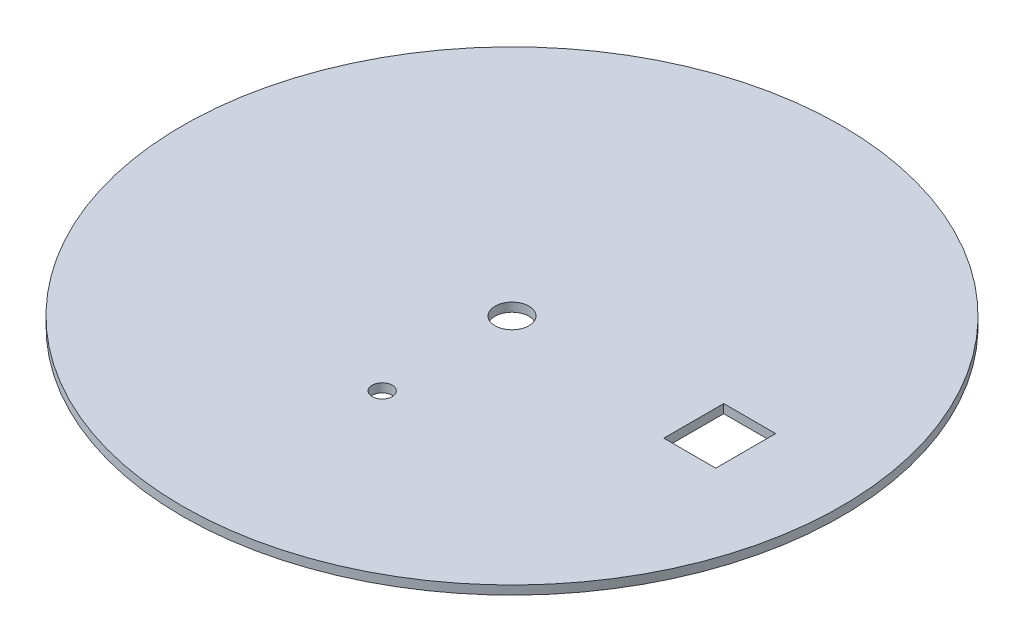
ISO-10303-21;
HEADER;
FILE_DESCRIPTION(('STEP AP214'),'2;1');
FILE_NAME('part.step','',(''),(''),'','','');
FILE_SCHEMA(('AUTOMOTIVE_DESIGN { 1 0 10303 214 1 1 1 1 }'));
ENDSEC;
DATA;
#1=APPLICATION_CONTEXT('core data for automotive mechanical design processes');
#2=APPLICATION_PROTOCOL_DEFINITION('international standard','automotive_design',2000,#1);
#3=PRODUCT_CONTEXT('',#1,'mechanical');
#4=PRODUCT('Part','Part','',(#3));
#5=PRODUCT_RELATED_PRODUCT_CATEGORY('part','',(#4));
#6=PRODUCT_DEFINITION_FORMATION('','',#4);
#7=PRODUCT_DEFINITION_CONTEXT('part definition',#1,'design');
#8=PRODUCT_DEFINITION('design','',#6,#7);
#9=PRODUCT_DEFINITION_SHAPE('','',#8);
#10=(LENGTH_UNIT() NAMED_UNIT(*) SI_UNIT(.MILLI.,.METRE.));
#11=(NAMED_UNIT(*) PLANE_ANGLE_UNIT() SI_UNIT($,.RADIAN.));
#12=(NAMED_UNIT(*) SI_UNIT($,.STERADIAN.) SOLID_ANGLE_UNIT());
#13=UNCERTAINTY_MEASURE_WITH_UNIT(LENGTH_MEASURE(1.E-05),#10,'distance_accuracy_value','');
#14=(GEOMETRIC_REPRESENTATION_CONTEXT(3) GLOBAL_UNCERTAINTY_ASSIGNED_CONTEXT((#13)) GLOBAL_UNIT_ASSIGNED_CONTEXT((#10,
#11,#12)) REPRESENTATION_CONTEXT('',''));
#15=CARTESIAN_POINT('',(0.,0.,0.));
#16=DIRECTION('',(0.,0.,1.));
#17=DIRECTION('',(1.,0.,0.));
#18=AXIS2_PLACEMENT_3D('',#15,#16,#17);
#19=CARTESIAN_POINT('',(0.,0.44,0.));
#20=DIRECTION('',(0.,-1.,0.));
#21=DIRECTION('',(0.,0.,-1.));
#22=AXIS2_PLACEMENT_3D('',#19,#20,#21);
#23=CYLINDRICAL_SURFACE('',#22,16.5);
#24=CARTESIAN_POINT('',(0.,0.44,0.));
#25=DIRECTION('',(0.,1.,0.));
#26=DIRECTION('',(0.,0.,1.));
#27=AXIS2_PLACEMENT_3D('',#24,#25,#26);
#28=CIRCLE('',#27,16.5);
#29=CARTESIAN_POINT('',(0.,0.44,16.5));
#30=VERTEX_POINT('',#29);
#31=EDGE_CURVE('E11',#30,#30,#28,.T.);
#32=ORIENTED_EDGE('',*,*,#31,.F.);
#33=EDGE_LOOP('',(#32));
#34=FACE_BOUND('',#33,.T.);
#35=CARTESIAN_POINT('',(0.,0.,0.));
#36=DIRECTION('',(0.,1.,0.));
#37=DIRECTION('',(0.,0.,1.));
#38=AXIS2_PLACEMENT_3D('',#35,#36,#37);
#39=CIRCLE('',#38,16.5);
#40=CARTESIAN_POINT('',(0.,0.,16.5));
#41=VERTEX_POINT('',#40);
#42=EDGE_CURVE('E36',#41,#41,#39,.T.);
#43=ORIENTED_EDGE('',*,*,#42,.T.);
#44=EDGE_LOOP('',(#43));
#45=FACE_BOUND('',#44,.T.);
#46=ADVANCED_FACE('F33',(#34,#45),#23,.T.);
#47=CARTESIAN_POINT('',(0.,0.44,0.));
#48=DIRECTION('',(0.,1.,0.));
#49=DIRECTION('',(0.,0.,1.));
#50=AXIS2_PLACEMENT_3D('',#47,#48,#49);
#51=PLANE('',#50);
#52=CARTESIAN_POINT('',(0.,0.44,6.5));
#53=DIRECTION('',(0.,1.,0.));
#54=DIRECTION('',(0.,0.,1.));
#55=AXIS2_PLACEMENT_3D('',#52,#53,#54);
#56=CIRCLE('',#55,0.5);
#57=CARTESIAN_POINT('',(0.,0.44,7.));
#58=VERTEX_POINT('',#57);
#59=EDGE_CURVE('E97',#58,#58,#56,.T.);
#60=ORIENTED_EDGE('',*,*,#59,.F.);
#61=EDGE_LOOP('',(#60));
#62=FACE_BOUND('',#61,.T.);
#63=DIRECTION('',(-1.,0.,0.));
#64=VECTOR('',#63,1.);
#65=CARTESIAN_POINT('',(9.1,0.44,-1.5));
#66=LINE('',#65,#64);
#67=CARTESIAN_POINT('',(11.7,0.44,-1.5));
#68=VERTEX_POINT('',#67);
#69=CARTESIAN_POINT('',(9.1,0.44,-1.5));
#70=VERTEX_POINT('',#69);
#71=EDGE_CURVE('E47',#68,#70,#66,.T.);
#72=ORIENTED_EDGE('',*,*,#71,.F.);
#73=DIRECTION('',(0.,0.,-1.));
#74=VECTOR('',#73,1.);
#75=CARTESIAN_POINT('',(11.7,0.44,-1.5));
#76=LINE('',#75,#74);
#77=CARTESIAN_POINT('',(11.7,0.44,1.5));
#78=VERTEX_POINT('',#77);
#79=EDGE_CURVE('E91',#78,#68,#76,.T.);
#80=ORIENTED_EDGE('',*,*,#79,.F.);
#81=DIRECTION('',(1.,0.,0.));
#82=VECTOR('',#81,1.);
#83=CARTESIAN_POINT('',(11.7,0.44,1.5));
#84=LINE('',#83,#82);
#85=CARTESIAN_POINT('',(9.1,0.44,1.5));
#86=VERTEX_POINT('',#85);
#87=EDGE_CURVE('E94',#86,#78,#84,.T.);
#88=ORIENTED_EDGE('',*,*,#87,.F.);
#89=DIRECTION('',(0.,0.,1.));
#90=VECTOR('',#89,1.);
#91=CARTESIAN_POINT('',(9.1,0.44,1.5));
#92=LINE('',#91,#90);
#93=EDGE_CURVE('E103',#70,#86,#92,.T.);
#94=ORIENTED_EDGE('',*,*,#93,.F.);
#95=EDGE_LOOP('',(#72,#80,#88,#94));
#96=FACE_BOUND('',#95,.T.);
#97=CARTESIAN_POINT('',(0.,0.44,0.));
#98=DIRECTION('',(0.,1.,0.));
#99=DIRECTION('',(0.,0.,1.));
#100=AXIS2_PLACEMENT_3D('',#97,#98,#99);
#101=CIRCLE('',#100,0.85);
#102=CARTESIAN_POINT('',(0.,0.44,0.85));
#103=VERTEX_POINT('',#102);
#104=EDGE_CURVE('E115',#103,#103,#101,.T.);
#105=ORIENTED_EDGE('',*,*,#104,.F.);
#106=EDGE_LOOP('',(#105));
#107=FACE_BOUND('',#106,.T.);
#108=ORIENTED_EDGE('',*,*,#31,.T.);
#109=EDGE_LOOP('',(#108));
#110=FACE_BOUND('',#109,.T.);
#111=ADVANCED_FACE('F128',(#62,#96,#107,#110),#51,.T.);
#112=CARTESIAN_POINT('',(0.,0.,0.));
#113=DIRECTION('',(0.,1.,0.));
#114=DIRECTION('',(0.,0.,1.));
#115=AXIS2_PLACEMENT_3D('',#112,#113,#114);
#116=PLANE('',#115);
#117=CARTESIAN_POINT('',(0.,0.,6.5));
#118=DIRECTION('',(0.,1.,0.));
#119=DIRECTION('',(0.,0.,1.));
#120=AXIS2_PLACEMENT_3D('',#117,#118,#119);
#121=CIRCLE('',#120,0.5);
#122=CARTESIAN_POINT('',(0.,0.,7.));
#123=VERTEX_POINT('',#122);
#124=EDGE_CURVE('E117',#123,#123,#121,.T.);
#125=ORIENTED_EDGE('',*,*,#124,.T.);
#126=EDGE_LOOP('',(#125));
#127=FACE_BOUND('',#126,.T.);
#128=DIRECTION('',(0.,0.,-1.));
#129=VECTOR('',#128,1.);
#130=CARTESIAN_POINT('',(11.7,0.,-1.5));
#131=LINE('',#130,#129);
#132=CARTESIAN_POINT('',(11.7,0.,1.5));
#133=VERTEX_POINT('',#132);
#134=CARTESIAN_POINT('',(11.7,0.,-1.5));
#135=VERTEX_POINT('',#134);
#136=EDGE_CURVE('E81',#133,#135,#131,.T.);
#137=ORIENTED_EDGE('',*,*,#136,.T.);
#138=DIRECTION('',(-1.,0.,0.));
#139=VECTOR('',#138,1.);
#140=CARTESIAN_POINT('',(9.1,0.,-1.5));
#141=LINE('',#140,#139);
#142=CARTESIAN_POINT('',(9.1,0.,-1.5));
#143=VERTEX_POINT('',#142);
#144=EDGE_CURVE('E75',#135,#143,#141,.T.);
#145=ORIENTED_EDGE('',*,*,#144,.T.);
#146=DIRECTION('',(0.,0.,1.));
#147=VECTOR('',#146,1.);
#148=CARTESIAN_POINT('',(9.1,0.,1.5));
#149=LINE('',#148,#147);
#150=CARTESIAN_POINT('',(9.1,0.,1.5));
#151=VERTEX_POINT('',#150);
#152=EDGE_CURVE('E84',#143,#151,#149,.T.);
#153=ORIENTED_EDGE('',*,*,#152,.T.);
#154=DIRECTION('',(1.,0.,0.));
#155=VECTOR('',#154,1.);
#156=CARTESIAN_POINT('',(11.7,0.,1.5));
#157=LINE('',#156,#155);
#158=EDGE_CURVE('E55',#151,#133,#157,.T.);
#159=ORIENTED_EDGE('',*,*,#158,.T.);
#160=EDGE_LOOP('',(#137,#145,#153,#159));
#161=FACE_BOUND('',#160,.T.);
#162=CARTESIAN_POINT('',(0.,0.,0.));
#163=DIRECTION('',(0.,1.,0.));
#164=DIRECTION('',(0.,0.,1.));
#165=AXIS2_PLACEMENT_3D('',#162,#163,#164);
#166=CIRCLE('',#165,0.85);
#167=CARTESIAN_POINT('',(0.,0.,0.85));
#168=VERTEX_POINT('',#167);
#169=EDGE_CURVE('E112',#168,#168,#166,.T.);
#170=ORIENTED_EDGE('',*,*,#169,.T.);
#171=EDGE_LOOP('',(#170));
#172=FACE_BOUND('',#171,.T.);
#173=ORIENTED_EDGE('',*,*,#42,.F.);
#174=EDGE_LOOP('',(#173));
#175=FACE_BOUND('',#174,.T.);
#176=ADVANCED_FACE('F88',(#127,#161,#172,#175),#116,.F.);
#177=CARTESIAN_POINT('',(0.,0.,0.));
#178=DIRECTION('',(0.,1.,0.));
#179=DIRECTION('',(0.,0.,1.));
#180=AXIS2_PLACEMENT_3D('',#177,#178,#179);
#181=CYLINDRICAL_SURFACE('',#180,0.85);
#182=ORIENTED_EDGE('',*,*,#169,.F.);
#183=EDGE_LOOP('',(#182));
#184=FACE_BOUND('',#183,.T.);
#185=ORIENTED_EDGE('',*,*,#104,.T.);
#186=EDGE_LOOP('',(#185));
#187=FACE_BOUND('',#186,.T.);
#188=ADVANCED_FACE('F143',(#184,#187),#181,.F.);
#189=CARTESIAN_POINT('',(9.1,0.,-1.5));
#190=DIRECTION('',(0.,0.,-1.));
#191=DIRECTION('',(-1.,0.,0.));
#192=AXIS2_PLACEMENT_3D('',#189,#190,#191);
#193=PLANE('',#192);
#194=ORIENTED_EDGE('',*,*,#71,.T.);
#195=DIRECTION('',(0.,1.,0.));
#196=VECTOR('',#195,1.);
#197=CARTESIAN_POINT('',(9.1,0.,-1.5));
#198=LINE('',#197,#196);
#199=EDGE_CURVE('E71',#143,#70,#198,.T.);
#200=ORIENTED_EDGE('',*,*,#199,.F.);
#201=ORIENTED_EDGE('',*,*,#144,.F.);
#202=DIRECTION('',(0.,1.,0.));
#203=VECTOR('',#202,1.);
#204=CARTESIAN_POINT('',(11.7,0.,-1.5));
#205=LINE('',#204,#203);
#206=EDGE_CURVE('E107',#135,#68,#205,.T.);
#207=ORIENTED_EDGE('',*,*,#206,.T.);
#208=EDGE_LOOP('',(#194,#200,#201,#207));
#209=FACE_BOUND('',#208,.T.);
#210=ADVANCED_FACE('F73',(#209),#193,.F.);
#211=CARTESIAN_POINT('',(11.7,0.,-1.5));
#212=DIRECTION('',(1.,0.,0.));
#213=DIRECTION('',(0.,0.,-1.));
#214=AXIS2_PLACEMENT_3D('',#211,#212,#213);
#215=PLANE('',#214);
#216=ORIENTED_EDGE('',*,*,#79,.T.);
#217=ORIENTED_EDGE('',*,*,#206,.F.);
#218=ORIENTED_EDGE('',*,*,#136,.F.);
#219=DIRECTION('',(0.,1.,0.));
#220=VECTOR('',#219,1.);
#221=CARTESIAN_POINT('',(11.7,0.,1.5));
#222=LINE('',#221,#220);
#223=EDGE_CURVE('E109',#133,#78,#222,.T.);
#224=ORIENTED_EDGE('',*,*,#223,.T.);
#225=EDGE_LOOP('',(#216,#217,#218,#224));
#226=FACE_BOUND('',#225,.T.);
#227=ADVANCED_FACE('F152',(#226),#215,.F.);
#228=CARTESIAN_POINT('',(11.7,0.,1.5));
#229=DIRECTION('',(0.,0.,1.));
#230=DIRECTION('',(1.,0.,0.));
#231=AXIS2_PLACEMENT_3D('',#228,#229,#230);
#232=PLANE('',#231);
#233=ORIENTED_EDGE('',*,*,#87,.T.);
#234=ORIENTED_EDGE('',*,*,#223,.F.);
#235=ORIENTED_EDGE('',*,*,#158,.F.);
#236=DIRECTION('',(0.,1.,0.));
#237=VECTOR('',#236,1.);
#238=CARTESIAN_POINT('',(9.1,0.,1.5));
#239=LINE('',#238,#237);
#240=EDGE_CURVE('E80',#151,#86,#239,.T.);
#241=ORIENTED_EDGE('',*,*,#240,.T.);
#242=EDGE_LOOP('',(#233,#234,#235,#241));
#243=FACE_BOUND('',#242,.T.);
#244=ADVANCED_FACE('F155',(#243),#232,.F.);
#245=CARTESIAN_POINT('',(9.1,0.,1.5));
#246=DIRECTION('',(-1.,0.,0.));
#247=DIRECTION('',(0.,0.,1.));
#248=AXIS2_PLACEMENT_3D('',#245,#246,#247);
#249=PLANE('',#248);
#250=ORIENTED_EDGE('',*,*,#93,.T.);
#251=ORIENTED_EDGE('',*,*,#240,.F.);
#252=ORIENTED_EDGE('',*,*,#152,.F.);
#253=ORIENTED_EDGE('',*,*,#199,.T.);
#254=EDGE_LOOP('',(#250,#251,#252,#253));
#255=FACE_BOUND('',#254,.T.);
#256=ADVANCED_FACE('F85',(#255),#249,.F.);
#257=CARTESIAN_POINT('',(0.,0.,6.5));
#258=DIRECTION('',(0.,1.,0.));
#259=DIRECTION('',(0.,0.,1.));
#260=AXIS2_PLACEMENT_3D('',#257,#258,#259);
#261=CYLINDRICAL_SURFACE('',#260,0.5);
#262=ORIENTED_EDGE('',*,*,#124,.F.);
#263=EDGE_LOOP('',(#262));
#264=FACE_BOUND('',#263,.T.);
#265=ORIENTED_EDGE('',*,*,#59,.T.);
#266=EDGE_LOOP('',(#265));
#267=FACE_BOUND('',#266,.T.);
#268=ADVANCED_FACE('F126',(#264,#267),#261,.F.);
#269=CLOSED_SHELL('',(#46,#111,#176,#188,#210,#227,#244,#256,#268));
#270=MANIFOLD_SOLID_BREP('B2',#269);
#271=ADVANCED_BREP_SHAPE_REPRESENTATION('',(#18,#270),#14);
#272=SHAPE_DEFINITION_REPRESENTATION(#9,#271);
ENDSEC;
END-ISO-10303-21;
